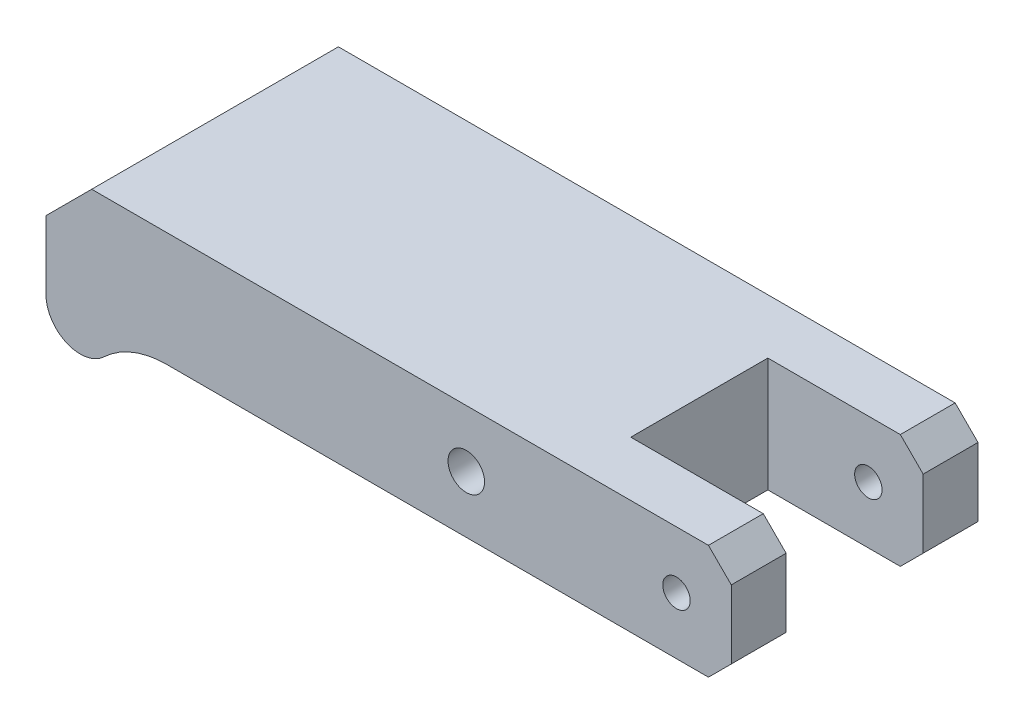
ISO-10303-21;
HEADER;
FILE_DESCRIPTION(('STEP AP214'),'2;1');
FILE_NAME('part.step','',(''),(''),'','','');
FILE_SCHEMA(('AUTOMOTIVE_DESIGN { 1 0 10303 214 1 1 1 1 }'));
ENDSEC;
DATA;
#1=APPLICATION_CONTEXT('core data for automotive mechanical design processes');
#2=APPLICATION_PROTOCOL_DEFINITION('international standard','automotive_design',2000,#1);
#3=PRODUCT_CONTEXT('',#1,'mechanical');
#4=PRODUCT('Part','Part','',(#3));
#5=PRODUCT_RELATED_PRODUCT_CATEGORY('part','',(#4));
#6=PRODUCT_DEFINITION_FORMATION('','',#4);
#7=PRODUCT_DEFINITION_CONTEXT('part definition',#1,'design');
#8=PRODUCT_DEFINITION('design','',#6,#7);
#9=PRODUCT_DEFINITION_SHAPE('','',#8);
#10=(LENGTH_UNIT() NAMED_UNIT(*) SI_UNIT(.MILLI.,.METRE.));
#11=(NAMED_UNIT(*) PLANE_ANGLE_UNIT() SI_UNIT($,.RADIAN.));
#12=(NAMED_UNIT(*) SI_UNIT($,.STERADIAN.) SOLID_ANGLE_UNIT());
#13=UNCERTAINTY_MEASURE_WITH_UNIT(LENGTH_MEASURE(1.E-05),#10,'distance_accuracy_value','');
#14=(GEOMETRIC_REPRESENTATION_CONTEXT(3) GLOBAL_UNCERTAINTY_ASSIGNED_CONTEXT((#13)) GLOBAL_UNIT_ASSIGNED_CONTEXT((#10,
#11,#12)) REPRESENTATION_CONTEXT('',''));
#15=CARTESIAN_POINT('',(0.,0.,0.));
#16=DIRECTION('',(0.,0.,1.));
#17=DIRECTION('',(1.,0.,0.));
#18=AXIS2_PLACEMENT_3D('',#15,#16,#17);
#19=CARTESIAN_POINT('',(75.,-12.5,54.));
#20=DIRECTION('',(-1.,0.,0.));
#21=DIRECTION('',(0.,0.,1.));
#22=AXIS2_PLACEMENT_3D('',#19,#20,#21);
#23=PLANE('',#22);
#24=DIRECTION('',(0.,1.,0.));
#25=VECTOR('',#24,1.);
#26=CARTESIAN_POINT('',(75.,-12.5,54.));
#27=LINE('',#26,#25);
#28=CARTESIAN_POINT('',(75.,-7.50000000000002,54.));
#29=VERTEX_POINT('',#28);
#30=CARTESIAN_POINT('',(75.,7.49999999999998,54.));
#31=VERTEX_POINT('',#30);
#32=EDGE_CURVE('E194',#29,#31,#27,.T.);
#33=ORIENTED_EDGE('',*,*,#32,.F.);
#34=DIRECTION('',(0.,0.,-1.));
#35=VECTOR('',#34,1.);
#36=CARTESIAN_POINT('',(75.,-7.50000000000002,54.));
#37=LINE('',#36,#35);
#38=CARTESIAN_POINT('',(75.,-7.50000000000002,42.));
#39=VERTEX_POINT('',#38);
#40=EDGE_CURVE('E236',#29,#39,#37,.T.);
#41=ORIENTED_EDGE('',*,*,#40,.T.);
#42=DIRECTION('',(0.,-1.,0.));
#43=VECTOR('',#42,1.);
#44=CARTESIAN_POINT('',(75.,12.5,42.));
#45=LINE('',#44,#43);
#46=CARTESIAN_POINT('',(75.,7.49999999999998,42.));
#47=VERTEX_POINT('',#46);
#48=EDGE_CURVE('E333',#47,#39,#45,.T.);
#49=ORIENTED_EDGE('',*,*,#48,.F.);
#50=DIRECTION('',(0.,0.,1.));
#51=VECTOR('',#50,1.);
#52=CARTESIAN_POINT('',(75.,7.49999999999998,54.));
#53=LINE('',#52,#51);
#54=EDGE_CURVE('E229',#47,#31,#53,.T.);
#55=ORIENTED_EDGE('',*,*,#54,.T.);
#56=EDGE_LOOP('',(#33,#41,#49,#55));
#57=FACE_BOUND('',#56,.T.);
#58=ADVANCED_FACE('F40',(#57),#23,.F.);
#59=CARTESIAN_POINT('',(63.,0.,54.));
#60=DIRECTION('',(0.,0.,-1.));
#61=DIRECTION('',(-1.,0.,0.));
#62=AXIS2_PLACEMENT_3D('',#59,#60,#61);
#63=CYLINDRICAL_SURFACE('',#62,3.00000000000001);
#64=CARTESIAN_POINT('',(63.,0.,42.));
#65=DIRECTION('',(0.,0.,1.));
#66=DIRECTION('',(1.,0.,0.));
#67=AXIS2_PLACEMENT_3D('',#64,#65,#66);
#68=CIRCLE('',#67,3.00000000000001);
#69=CARTESIAN_POINT('',(66.,0.,42.));
#70=VERTEX_POINT('',#69);
#71=EDGE_CURVE('E187',#70,#70,#68,.T.);
#72=ORIENTED_EDGE('',*,*,#71,.F.);
#73=EDGE_LOOP('',(#72));
#74=FACE_BOUND('',#73,.T.);
#75=CARTESIAN_POINT('',(63.,0.,54.));
#76=DIRECTION('',(0.,0.,1.));
#77=DIRECTION('',(1.,0.,0.));
#78=AXIS2_PLACEMENT_3D('',#75,#76,#77);
#79=CIRCLE('',#78,3.00000000000001);
#80=CARTESIAN_POINT('',(66.,0.,54.));
#81=VERTEX_POINT('',#80);
#82=EDGE_CURVE('E188',#81,#81,#79,.T.);
#83=ORIENTED_EDGE('',*,*,#82,.T.);
#84=EDGE_LOOP('',(#83));
#85=FACE_BOUND('',#84,.T.);
#86=ADVANCED_FACE('F305',(#74,#85),#63,.F.);
#87=CARTESIAN_POINT('',(-67.5,-12.5,54.));
#88=DIRECTION('',(0.,0.,1.));
#89=DIRECTION('',(1.,0.,0.));
#90=AXIS2_PLACEMENT_3D('',#87,#88,#89);
#91=PLANE('',#90);
#92=ORIENTED_EDGE('',*,*,#82,.F.);
#93=EDGE_LOOP('',(#92));
#94=FACE_BOUND('',#93,.T.);
#95=DIRECTION('',(-1.,0.,0.));
#96=VECTOR('',#95,1.);
#97=CARTESIAN_POINT('',(-75.,12.5,54.));
#98=LINE('',#97,#96);
#99=CARTESIAN_POINT('',(70.,12.5,54.));
#100=VERTEX_POINT('',#99);
#101=CARTESIAN_POINT('',(-65.,12.5,54.));
#102=VERTEX_POINT('',#101);
#103=EDGE_CURVE('E197',#100,#102,#98,.T.);
#104=ORIENTED_EDGE('',*,*,#103,.T.);
#105=DIRECTION('',(0.707106781186548,0.707106781186547,0.));
#106=VECTOR('',#105,1.);
#107=CARTESIAN_POINT('',(-78.75,-1.25,54.));
#108=LINE('',#107,#106);
#109=CARTESIAN_POINT('',(-75.,2.5,54.));
#110=VERTEX_POINT('',#109);
#111=EDGE_CURVE('E11',#102,#110,#108,.F.);
#112=ORIENTED_EDGE('',*,*,#111,.T.);
#113=DIRECTION('',(0.,-1.,0.));
#114=VECTOR('',#113,1.);
#115=CARTESIAN_POINT('',(-75.,-12.5,54.));
#116=LINE('',#115,#114);
#117=CARTESIAN_POINT('',(-75.,-12.5,54.));
#118=VERTEX_POINT('',#117);
#119=EDGE_CURVE('E200',#110,#118,#116,.T.);
#120=ORIENTED_EDGE('',*,*,#119,.T.);
#121=CARTESIAN_POINT('',(-67.5,-12.5,54.));
#122=DIRECTION('',(0.,0.,1.));
#123=DIRECTION('',(1.,0.,0.));
#124=AXIS2_PLACEMENT_3D('',#121,#122,#123);
#125=CIRCLE('',#124,7.5);
#126=CARTESIAN_POINT('',(-62.3523856123154,-17.9545454545455,54.));
#127=VERTEX_POINT('',#126);
#128=EDGE_CURVE('E202',#118,#127,#125,.T.);
#129=ORIENTED_EDGE('',*,*,#128,.T.);
#130=CARTESIAN_POINT('',(-48.6254139118231,-32.5,54.));
#131=DIRECTION('',(0.,0.,-1.));
#132=DIRECTION('',(-1.,0.,0.));
#133=AXIS2_PLACEMENT_3D('',#130,#131,#132);
#134=CIRCLE('',#133,20.);
#135=CARTESIAN_POINT('',(-48.6254139118231,-12.5,54.));
#136=VERTEX_POINT('',#135);
#137=EDGE_CURVE('E204',#127,#136,#134,.T.);
#138=ORIENTED_EDGE('',*,*,#137,.T.);
#139=DIRECTION('',(1.,0.,0.));
#140=VECTOR('',#139,1.);
#141=CARTESIAN_POINT('',(-48.6254139118231,-12.5,54.));
#142=LINE('',#141,#140);
#143=CARTESIAN_POINT('',(70.,-12.5,54.));
#144=VERTEX_POINT('',#143);
#145=EDGE_CURVE('E206',#136,#144,#142,.T.);
#146=ORIENTED_EDGE('',*,*,#145,.T.);
#147=DIRECTION('',(-0.70710678118655,-0.707106781186546,0.));
#148=VECTOR('',#147,1.);
#149=CARTESIAN_POINT('',(1.2499999999996,-81.25,54.));
#150=LINE('',#149,#148);
#151=EDGE_CURVE('E248',#144,#29,#150,.F.);
#152=ORIENTED_EDGE('',*,*,#151,.T.);
#153=ORIENTED_EDGE('',*,*,#32,.T.);
#154=DIRECTION('',(0.707106781186549,-0.707106781186547,0.));
#155=VECTOR('',#154,1.);
#156=CARTESIAN_POINT('',(13.7499999999998,68.75,54.));
#157=LINE('',#156,#155);
#158=EDGE_CURVE('E246',#31,#100,#157,.F.);
#159=ORIENTED_EDGE('',*,*,#158,.T.);
#160=EDGE_LOOP('',(#104,#112,#120,#129,#138,#146,#152,#153,#159));
#161=FACE_BOUND('',#160,.T.);
#162=CARTESIAN_POINT('',(17.,0.,54.));
#163=DIRECTION('',(0.,0.,1.));
#164=DIRECTION('',(1.,0.,0.));
#165=AXIS2_PLACEMENT_3D('',#162,#163,#164);
#166=CIRCLE('',#165,4.);
#167=CARTESIAN_POINT('',(21.,0.,54.));
#168=VERTEX_POINT('',#167);
#169=EDGE_CURVE('E180',#168,#168,#166,.T.);
#170=ORIENTED_EDGE('',*,*,#169,.F.);
#171=EDGE_LOOP('',(#170));
#172=FACE_BOUND('',#171,.T.);
#173=ADVANCED_FACE('F294',(#94,#161,#172),#91,.T.);
#174=CARTESIAN_POINT('',(-67.5,-12.5,0.));
#175=DIRECTION('',(0.,0.,1.));
#176=DIRECTION('',(1.,0.,0.));
#177=AXIS2_PLACEMENT_3D('',#174,#175,#176);
#178=PLANE('',#177);
#179=DIRECTION('',(0.,-1.,0.));
#180=VECTOR('',#179,1.);
#181=CARTESIAN_POINT('',(-75.,-12.5,0.));
#182=LINE('',#181,#180);
#183=CARTESIAN_POINT('',(-75.,2.5,0.));
#184=VERTEX_POINT('',#183);
#185=CARTESIAN_POINT('',(-75.,-12.5,0.));
#186=VERTEX_POINT('',#185);
#187=EDGE_CURVE('E214',#184,#186,#182,.T.);
#188=ORIENTED_EDGE('',*,*,#187,.F.);
#189=DIRECTION('',(-0.707106781186548,-0.707106781186547,0.));
#190=VECTOR('',#189,1.);
#191=CARTESIAN_POINT('',(-75.,2.5,0.));
#192=LINE('',#191,#190);
#193=CARTESIAN_POINT('',(-65.,12.5,0.));
#194=VERTEX_POINT('',#193);
#195=EDGE_CURVE('E63',#184,#194,#192,.F.);
#196=ORIENTED_EDGE('',*,*,#195,.T.);
#197=DIRECTION('',(-1.,0.,0.));
#198=VECTOR('',#197,1.);
#199=CARTESIAN_POINT('',(-75.,12.5,0.));
#200=LINE('',#199,#198);
#201=CARTESIAN_POINT('',(70.,12.5,0.));
#202=VERTEX_POINT('',#201);
#203=EDGE_CURVE('E212',#202,#194,#200,.T.);
#204=ORIENTED_EDGE('',*,*,#203,.F.);
#205=DIRECTION('',(-0.707106781186549,0.707106781186547,0.));
#206=VECTOR('',#205,1.);
#207=CARTESIAN_POINT('',(70.,12.5,0.));
#208=LINE('',#207,#206);
#209=CARTESIAN_POINT('',(75.,7.49999999999998,0.));
#210=VERTEX_POINT('',#209);
#211=EDGE_CURVE('E255',#202,#210,#208,.F.);
#212=ORIENTED_EDGE('',*,*,#211,.T.);
#213=DIRECTION('',(0.,1.,0.));
#214=VECTOR('',#213,1.);
#215=CARTESIAN_POINT('',(75.,-12.5,0.));
#216=LINE('',#215,#214);
#217=CARTESIAN_POINT('',(75.,-7.50000000000002,0.));
#218=VERTEX_POINT('',#217);
#219=EDGE_CURVE('E191',#218,#210,#216,.T.);
#220=ORIENTED_EDGE('',*,*,#219,.F.);
#221=DIRECTION('',(0.70710678118655,0.707106781186546,0.));
#222=VECTOR('',#221,1.);
#223=CARTESIAN_POINT('',(75.,-7.50000000000002,0.));
#224=LINE('',#223,#222);
#225=CARTESIAN_POINT('',(70.,-12.5,0.));
#226=VERTEX_POINT('',#225);
#227=EDGE_CURVE('E257',#218,#226,#224,.F.);
#228=ORIENTED_EDGE('',*,*,#227,.T.);
#229=DIRECTION('',(1.,0.,0.));
#230=VECTOR('',#229,1.);
#231=CARTESIAN_POINT('',(-48.6254139118231,-12.5,0.));
#232=LINE('',#231,#230);
#233=CARTESIAN_POINT('',(-48.6254139118231,-12.5,0.));
#234=VERTEX_POINT('',#233);
#235=EDGE_CURVE('E198',#234,#226,#232,.T.);
#236=ORIENTED_EDGE('',*,*,#235,.F.);
#237=CARTESIAN_POINT('',(-48.6254139118231,-32.5,0.));
#238=DIRECTION('',(0.,0.,-1.));
#239=DIRECTION('',(-1.,0.,0.));
#240=AXIS2_PLACEMENT_3D('',#237,#238,#239);
#241=CIRCLE('',#240,20.);
#242=CARTESIAN_POINT('',(-62.3523856123154,-17.9545454545455,0.));
#243=VERTEX_POINT('',#242);
#244=EDGE_CURVE('E218',#243,#234,#241,.T.);
#245=ORIENTED_EDGE('',*,*,#244,.F.);
#246=CARTESIAN_POINT('',(-67.5,-12.5,0.));
#247=DIRECTION('',(0.,0.,1.));
#248=DIRECTION('',(1.,0.,0.));
#249=AXIS2_PLACEMENT_3D('',#246,#247,#248);
#250=CIRCLE('',#249,7.5);
#251=EDGE_CURVE('E216',#186,#243,#250,.T.);
#252=ORIENTED_EDGE('',*,*,#251,.F.);
#253=EDGE_LOOP('',(#188,#196,#204,#212,#220,#228,#236,#245,#252));
#254=FACE_BOUND('',#253,.T.);
#255=CARTESIAN_POINT('',(63.,0.,0.));
#256=DIRECTION('',(0.,0.,1.));
#257=DIRECTION('',(1.,0.,0.));
#258=AXIS2_PLACEMENT_3D('',#255,#256,#257);
#259=CIRCLE('',#258,3.00000000000001);
#260=CARTESIAN_POINT('',(66.,0.,0.));
#261=VERTEX_POINT('',#260);
#262=EDGE_CURVE('E183',#261,#261,#259,.T.);
#263=ORIENTED_EDGE('',*,*,#262,.T.);
#264=EDGE_LOOP('',(#263));
#265=FACE_BOUND('',#264,.T.);
#266=CARTESIAN_POINT('',(17.,0.,0.));
#267=DIRECTION('',(0.,0.,1.));
#268=DIRECTION('',(1.,0.,0.));
#269=AXIS2_PLACEMENT_3D('',#266,#267,#268);
#270=CIRCLE('',#269,4.);
#271=CARTESIAN_POINT('',(21.,0.,0.));
#272=VERTEX_POINT('',#271);
#273=EDGE_CURVE('E184',#272,#272,#270,.T.);
#274=ORIENTED_EDGE('',*,*,#273,.T.);
#275=EDGE_LOOP('',(#274));
#276=FACE_BOUND('',#275,.T.);
#277=ADVANCED_FACE('F280',(#254,#265,#276),#178,.F.);
#278=DIRECTION('',(0.,1.,0.));
#279=VECTOR('',#278,1.);
#280=CARTESIAN_POINT('',(75.,12.5,12.));
#281=LINE('',#280,#279);
#282=CARTESIAN_POINT('',(75.,-7.50000000000002,12.));
#283=VERTEX_POINT('',#282);
#284=CARTESIAN_POINT('',(75.,7.49999999999998,12.));
#285=VERTEX_POINT('',#284);
#286=EDGE_CURVE('E328',#283,#285,#281,.T.);
#287=ORIENTED_EDGE('',*,*,#286,.F.);
#288=DIRECTION('',(0.,0.,-1.));
#289=VECTOR('',#288,1.);
#290=CARTESIAN_POINT('',(75.,-7.50000000000002,54.));
#291=LINE('',#290,#289);
#292=EDGE_CURVE('E252',#283,#218,#291,.T.);
#293=ORIENTED_EDGE('',*,*,#292,.T.);
#294=ORIENTED_EDGE('',*,*,#219,.T.);
#295=DIRECTION('',(0.,0.,1.));
#296=VECTOR('',#295,1.);
#297=CARTESIAN_POINT('',(75.,7.49999999999998,54.));
#298=LINE('',#297,#296);
#299=EDGE_CURVE('E250',#210,#285,#298,.T.);
#300=ORIENTED_EDGE('',*,*,#299,.T.);
#301=EDGE_LOOP('',(#287,#293,#294,#300));
#302=FACE_BOUND('',#301,.T.);
#303=ADVANCED_FACE('F308',(#302),#23,.F.);
#304=CARTESIAN_POINT('',(-75.,12.5,54.));
#305=DIRECTION('',(0.,-1.,0.));
#306=DIRECTION('',(0.,0.,-1.));
#307=AXIS2_PLACEMENT_3D('',#304,#305,#306);
#308=PLANE('',#307);
#309=ORIENTED_EDGE('',*,*,#203,.T.);
#310=DIRECTION('',(0.,0.,1.));
#311=VECTOR('',#310,1.);
#312=CARTESIAN_POINT('',(-65.,12.5,54.));
#313=LINE('',#312,#311);
#314=EDGE_CURVE('E49',#194,#102,#313,.T.);
#315=ORIENTED_EDGE('',*,*,#314,.T.);
#316=ORIENTED_EDGE('',*,*,#103,.F.);
#317=DIRECTION('',(0.,0.,-1.));
#318=VECTOR('',#317,1.);
#319=CARTESIAN_POINT('',(70.,12.5,54.));
#320=LINE('',#319,#318);
#321=CARTESIAN_POINT('',(70.,12.5,42.));
#322=VERTEX_POINT('',#321);
#323=EDGE_CURVE('E263',#100,#322,#320,.T.);
#324=ORIENTED_EDGE('',*,*,#323,.T.);
#325=DIRECTION('',(1.,0.,0.));
#326=VECTOR('',#325,1.);
#327=CARTESIAN_POINT('',(41.,12.5,42.));
#328=LINE('',#327,#326);
#329=CARTESIAN_POINT('',(41.,12.5,42.));
#330=VERTEX_POINT('',#329);
#331=EDGE_CURVE('E175',#330,#322,#328,.T.);
#332=ORIENTED_EDGE('',*,*,#331,.F.);
#333=DIRECTION('',(0.,0.,1.));
#334=VECTOR('',#333,1.);
#335=CARTESIAN_POINT('',(41.,12.5,42.));
#336=LINE('',#335,#334);
#337=CARTESIAN_POINT('',(41.,12.5,12.));
#338=VERTEX_POINT('',#337);
#339=EDGE_CURVE('E159',#338,#330,#336,.T.);
#340=ORIENTED_EDGE('',*,*,#339,.F.);
#341=DIRECTION('',(1.,0.,0.));
#342=VECTOR('',#341,1.);
#343=CARTESIAN_POINT('',(41.,12.5,12.));
#344=LINE('',#343,#342);
#345=CARTESIAN_POINT('',(70.,12.5,12.));
#346=VERTEX_POINT('',#345);
#347=EDGE_CURVE('E155',#338,#346,#344,.T.);
#348=ORIENTED_EDGE('',*,*,#347,.T.);
#349=DIRECTION('',(0.,0.,-1.));
#350=VECTOR('',#349,1.);
#351=CARTESIAN_POINT('',(70.,12.5,54.));
#352=LINE('',#351,#350);
#353=EDGE_CURVE('E266',#346,#202,#352,.T.);
#354=ORIENTED_EDGE('',*,*,#353,.T.);
#355=EDGE_LOOP('',(#309,#315,#316,#324,#332,#340,#348,#354));
#356=FACE_BOUND('',#355,.T.);
#357=ADVANCED_FACE('F319',(#356),#308,.F.);
#358=CARTESIAN_POINT('',(-75.,-12.5,54.));
#359=DIRECTION('',(1.,0.,0.));
#360=DIRECTION('',(0.,0.,-1.));
#361=AXIS2_PLACEMENT_3D('',#358,#359,#360);
#362=PLANE('',#361);
#363=ORIENTED_EDGE('',*,*,#119,.F.);
#364=DIRECTION('',(0.,0.,-1.));
#365=VECTOR('',#364,1.);
#366=CARTESIAN_POINT('',(-75.,2.5,54.));
#367=LINE('',#366,#365);
#368=EDGE_CURVE('E269',#110,#184,#367,.T.);
#369=ORIENTED_EDGE('',*,*,#368,.T.);
#370=ORIENTED_EDGE('',*,*,#187,.T.);
#371=DIRECTION('',(0.,0.,-1.));
#372=VECTOR('',#371,1.);
#373=CARTESIAN_POINT('',(-75.,-12.5,54.));
#374=LINE('',#373,#372);
#375=EDGE_CURVE('E226',#118,#186,#374,.T.);
#376=ORIENTED_EDGE('',*,*,#375,.F.);
#377=EDGE_LOOP('',(#363,#369,#370,#376));
#378=FACE_BOUND('',#377,.T.);
#379=ADVANCED_FACE('F275',(#378),#362,.F.);
#380=CARTESIAN_POINT('',(-67.5,-12.5,54.));
#381=DIRECTION('',(0.,0.,-1.));
#382=DIRECTION('',(-1.,0.,0.));
#383=AXIS2_PLACEMENT_3D('',#380,#381,#382);
#384=CYLINDRICAL_SURFACE('',#383,7.5);
#385=ORIENTED_EDGE('',*,*,#251,.T.);
#386=DIRECTION('',(0.,0.,-1.));
#387=VECTOR('',#386,1.);
#388=CARTESIAN_POINT('',(-62.3523856123154,-17.9545454545455,54.));
#389=LINE('',#388,#387);
#390=EDGE_CURVE('E223',#127,#243,#389,.T.);
#391=ORIENTED_EDGE('',*,*,#390,.F.);
#392=ORIENTED_EDGE('',*,*,#128,.F.);
#393=ORIENTED_EDGE('',*,*,#375,.T.);
#394=EDGE_LOOP('',(#385,#391,#392,#393));
#395=FACE_BOUND('',#394,.T.);
#396=ADVANCED_FACE('F286',(#395),#384,.T.);
#397=CARTESIAN_POINT('',(-48.6254139118231,-32.5,54.));
#398=DIRECTION('',(0.,0.,-1.));
#399=DIRECTION('',(-1.,0.,0.));
#400=AXIS2_PLACEMENT_3D('',#397,#398,#399);
#401=CYLINDRICAL_SURFACE('',#400,20.);
#402=ORIENTED_EDGE('',*,*,#244,.T.);
#403=DIRECTION('',(0.,0.,-1.));
#404=VECTOR('',#403,1.);
#405=CARTESIAN_POINT('',(-48.6254139118231,-12.5,54.));
#406=LINE('',#405,#404);
#407=EDGE_CURVE('E209',#136,#234,#406,.T.);
#408=ORIENTED_EDGE('',*,*,#407,.F.);
#409=ORIENTED_EDGE('',*,*,#137,.F.);
#410=ORIENTED_EDGE('',*,*,#390,.T.);
#411=EDGE_LOOP('',(#402,#408,#409,#410));
#412=FACE_BOUND('',#411,.T.);
#413=ADVANCED_FACE('F290',(#412),#401,.F.);
#414=CARTESIAN_POINT('',(-48.6254139118231,-12.5,54.));
#415=DIRECTION('',(0.,1.,0.));
#416=DIRECTION('',(0.,0.,1.));
#417=AXIS2_PLACEMENT_3D('',#414,#415,#416);
#418=PLANE('',#417);
#419=DIRECTION('',(1.,0.,0.));
#420=VECTOR('',#419,1.);
#421=CARTESIAN_POINT('',(41.,-12.5,42.));
#422=LINE('',#421,#420);
#423=CARTESIAN_POINT('',(41.,-12.5,42.));
#424=VERTEX_POINT('',#423);
#425=CARTESIAN_POINT('',(70.,-12.5,42.));
#426=VERTEX_POINT('',#425);
#427=EDGE_CURVE('E173',#424,#426,#422,.T.);
#428=ORIENTED_EDGE('',*,*,#427,.T.);
#429=DIRECTION('',(0.,0.,1.));
#430=VECTOR('',#429,1.);
#431=CARTESIAN_POINT('',(70.,-12.5,54.));
#432=LINE('',#431,#430);
#433=EDGE_CURVE('E244',#426,#144,#432,.T.);
#434=ORIENTED_EDGE('',*,*,#433,.T.);
#435=ORIENTED_EDGE('',*,*,#145,.F.);
#436=ORIENTED_EDGE('',*,*,#407,.T.);
#437=ORIENTED_EDGE('',*,*,#235,.T.);
#438=DIRECTION('',(0.,0.,1.));
#439=VECTOR('',#438,1.);
#440=CARTESIAN_POINT('',(70.,-12.5,54.));
#441=LINE('',#440,#439);
#442=CARTESIAN_POINT('',(70.,-12.5,12.));
#443=VERTEX_POINT('',#442);
#444=EDGE_CURVE('E172',#226,#443,#441,.T.);
#445=ORIENTED_EDGE('',*,*,#444,.T.);
#446=DIRECTION('',(1.,0.,0.));
#447=VECTOR('',#446,1.);
#448=CARTESIAN_POINT('',(41.,-12.5,12.));
#449=LINE('',#448,#447);
#450=CARTESIAN_POINT('',(41.,-12.5,12.));
#451=VERTEX_POINT('',#450);
#452=EDGE_CURVE('E152',#451,#443,#449,.T.);
#453=ORIENTED_EDGE('',*,*,#452,.F.);
#454=DIRECTION('',(0.,0.,-1.));
#455=VECTOR('',#454,1.);
#456=CARTESIAN_POINT('',(41.,-12.5,42.));
#457=LINE('',#456,#455);
#458=EDGE_CURVE('E160',#424,#451,#457,.T.);
#459=ORIENTED_EDGE('',*,*,#458,.F.);
#460=EDGE_LOOP('',(#428,#434,#435,#436,#437,#445,#453,#459));
#461=FACE_BOUND('',#460,.T.);
#462=ADVANCED_FACE('F169',(#461),#418,.F.);
#463=CARTESIAN_POINT('',(63.,0.,12.));
#464=DIRECTION('',(0.,0.,-1.));
#465=DIRECTION('',(0.,1.,0.));
#466=AXIS2_PLACEMENT_3D('',#463,#464,#465);
#467=CIRCLE('',#466,3.00000000000001);
#468=CARTESIAN_POINT('',(63.,3.00000000000001,12.));
#469=VERTEX_POINT('',#468);
#470=EDGE_CURVE('E230',#469,#469,#467,.T.);
#471=ORIENTED_EDGE('',*,*,#470,.F.);
#472=EDGE_LOOP('',(#471));
#473=FACE_BOUND('',#472,.T.);
#474=ORIENTED_EDGE('',*,*,#262,.F.);
#475=EDGE_LOOP('',(#474));
#476=FACE_BOUND('',#475,.T.);
#477=ADVANCED_FACE('F314',(#473,#476),#63,.F.);
#478=CARTESIAN_POINT('',(17.,0.,54.));
#479=DIRECTION('',(0.,0.,-1.));
#480=DIRECTION('',(-1.,0.,0.));
#481=AXIS2_PLACEMENT_3D('',#478,#479,#480);
#482=CYLINDRICAL_SURFACE('',#481,4.);
#483=ORIENTED_EDGE('',*,*,#169,.T.);
#484=EDGE_LOOP('',(#483));
#485=FACE_BOUND('',#484,.T.);
#486=ORIENTED_EDGE('',*,*,#273,.F.);
#487=EDGE_LOOP('',(#486));
#488=FACE_BOUND('',#487,.T.);
#489=ADVANCED_FACE('F388',(#485,#488),#482,.F.);
#490=CARTESIAN_POINT('',(41.,12.5,42.));
#491=DIRECTION('',(0.,0.,1.));
#492=DIRECTION('',(1.,0.,0.));
#493=AXIS2_PLACEMENT_3D('',#490,#491,#492);
#494=PLANE('',#493);
#495=ORIENTED_EDGE('',*,*,#71,.T.);
#496=EDGE_LOOP('',(#495));
#497=FACE_BOUND('',#496,.T.);
#498=ORIENTED_EDGE('',*,*,#48,.T.);
#499=DIRECTION('',(0.70710678118655,0.707106781186546,0.));
#500=VECTOR('',#499,1.);
#501=CARTESIAN_POINT('',(75.,-7.50000000000002,42.));
#502=LINE('',#501,#500);
#503=EDGE_CURVE('E241',#39,#426,#502,.F.);
#504=ORIENTED_EDGE('',*,*,#503,.T.);
#505=ORIENTED_EDGE('',*,*,#427,.F.);
#506=DIRECTION('',(0.,-1.,0.));
#507=VECTOR('',#506,1.);
#508=CARTESIAN_POINT('',(41.,12.5,42.));
#509=LINE('',#508,#507);
#510=EDGE_CURVE('E164',#330,#424,#509,.T.);
#511=ORIENTED_EDGE('',*,*,#510,.F.);
#512=ORIENTED_EDGE('',*,*,#331,.T.);
#513=DIRECTION('',(-0.707106781186549,0.707106781186547,0.));
#514=VECTOR('',#513,1.);
#515=CARTESIAN_POINT('',(70.,12.5,42.));
#516=LINE('',#515,#514);
#517=EDGE_CURVE('E239',#322,#47,#516,.F.);
#518=ORIENTED_EDGE('',*,*,#517,.T.);
#519=EDGE_LOOP('',(#498,#504,#505,#511,#512,#518));
#520=FACE_BOUND('',#519,.T.);
#521=ADVANCED_FACE('F349',(#497,#520),#494,.F.);
#522=CARTESIAN_POINT('',(41.,12.5,12.));
#523=DIRECTION('',(0.,0.,-1.));
#524=DIRECTION('',(0.,1.,0.));
#525=AXIS2_PLACEMENT_3D('',#522,#523,#524);
#526=PLANE('',#525);
#527=ORIENTED_EDGE('',*,*,#470,.T.);
#528=EDGE_LOOP('',(#527));
#529=FACE_BOUND('',#528,.T.);
#530=ORIENTED_EDGE('',*,*,#452,.T.);
#531=DIRECTION('',(-0.70710678118655,-0.707106781186546,0.));
#532=VECTOR('',#531,1.);
#533=CARTESIAN_POINT('',(75.,-7.50000000000001,12.));
#534=LINE('',#533,#532);
#535=EDGE_CURVE('E261',#443,#283,#534,.F.);
#536=ORIENTED_EDGE('',*,*,#535,.T.);
#537=ORIENTED_EDGE('',*,*,#286,.T.);
#538=DIRECTION('',(0.707106781186549,-0.707106781186547,0.));
#539=VECTOR('',#538,1.);
#540=CARTESIAN_POINT('',(70.,12.5,12.));
#541=LINE('',#540,#539);
#542=EDGE_CURVE('E259',#285,#346,#541,.F.);
#543=ORIENTED_EDGE('',*,*,#542,.T.);
#544=ORIENTED_EDGE('',*,*,#347,.F.);
#545=DIRECTION('',(0.,1.,0.));
#546=VECTOR('',#545,1.);
#547=CARTESIAN_POINT('',(41.,12.5,12.));
#548=LINE('',#547,#546);
#549=EDGE_CURVE('E148',#451,#338,#548,.T.);
#550=ORIENTED_EDGE('',*,*,#549,.F.);
#551=EDGE_LOOP('',(#530,#536,#537,#543,#544,#550));
#552=FACE_BOUND('',#551,.T.);
#553=ADVANCED_FACE('F150',(#529,#552),#526,.F.);
#554=CARTESIAN_POINT('',(41.,0.,0.));
#555=DIRECTION('',(1.,0.,0.));
#556=DIRECTION('',(0.,0.,-1.));
#557=AXIS2_PLACEMENT_3D('',#554,#555,#556);
#558=PLANE('',#557);
#559=ORIENTED_EDGE('',*,*,#510,.T.);
#560=ORIENTED_EDGE('',*,*,#458,.T.);
#561=ORIENTED_EDGE('',*,*,#549,.T.);
#562=ORIENTED_EDGE('',*,*,#339,.T.);
#563=EDGE_LOOP('',(#559,#560,#561,#562));
#564=FACE_BOUND('',#563,.T.);
#565=ADVANCED_FACE('F163',(#564),#558,.T.);
#566=CARTESIAN_POINT('',(75.,-7.50000000000002,54.));
#567=DIRECTION('',(-0.707106781186545,0.707106781186549,0.));
#568=DIRECTION('',(0.,0.,-1.));
#569=AXIS2_PLACEMENT_3D('',#566,#567,#568);
#570=PLANE('',#569);
#571=ORIENTED_EDGE('',*,*,#151,.F.);
#572=ORIENTED_EDGE('',*,*,#433,.F.);
#573=ORIENTED_EDGE('',*,*,#503,.F.);
#574=ORIENTED_EDGE('',*,*,#40,.F.);
#575=EDGE_LOOP('',(#571,#572,#573,#574));
#576=FACE_BOUND('',#575,.T.);
#577=ADVANCED_FACE('F339',(#576),#570,.F.);
#578=CARTESIAN_POINT('',(75.,-7.50000000000002,54.));
#579=DIRECTION('',(-0.707106781186545,0.707106781186549,0.));
#580=DIRECTION('',(0.,0.,-1.));
#581=AXIS2_PLACEMENT_3D('',#578,#579,#580);
#582=PLANE('',#581);
#583=ORIENTED_EDGE('',*,*,#535,.F.);
#584=ORIENTED_EDGE('',*,*,#444,.F.);
#585=ORIENTED_EDGE('',*,*,#227,.F.);
#586=ORIENTED_EDGE('',*,*,#292,.F.);
#587=EDGE_LOOP('',(#583,#584,#585,#586));
#588=FACE_BOUND('',#587,.T.);
#589=ADVANCED_FACE('F336',(#588),#582,.F.);
#590=CARTESIAN_POINT('',(70.,12.5,54.));
#591=DIRECTION('',(-0.707106781186546,-0.707106781186548,0.));
#592=DIRECTION('',(0.,0.,-1.));
#593=AXIS2_PLACEMENT_3D('',#590,#591,#592);
#594=PLANE('',#593);
#595=ORIENTED_EDGE('',*,*,#542,.F.);
#596=ORIENTED_EDGE('',*,*,#299,.F.);
#597=ORIENTED_EDGE('',*,*,#211,.F.);
#598=ORIENTED_EDGE('',*,*,#353,.F.);
#599=EDGE_LOOP('',(#595,#596,#597,#598));
#600=FACE_BOUND('',#599,.T.);
#601=ADVANCED_FACE('F302',(#600),#594,.F.);
#602=CARTESIAN_POINT('',(70.,12.5,54.));
#603=DIRECTION('',(-0.707106781186546,-0.707106781186548,0.));
#604=DIRECTION('',(0.,0.,-1.));
#605=AXIS2_PLACEMENT_3D('',#602,#603,#604);
#606=PLANE('',#605);
#607=ORIENTED_EDGE('',*,*,#158,.F.);
#608=ORIENTED_EDGE('',*,*,#54,.F.);
#609=ORIENTED_EDGE('',*,*,#517,.F.);
#610=ORIENTED_EDGE('',*,*,#323,.F.);
#611=EDGE_LOOP('',(#607,#608,#609,#610));
#612=FACE_BOUND('',#611,.T.);
#613=ADVANCED_FACE('F298',(#612),#606,.F.);
#614=CARTESIAN_POINT('',(-75.,2.5,54.));
#615=DIRECTION('',(0.707106781186547,-0.707106781186548,0.));
#616=DIRECTION('',(0.,0.,-1.));
#617=AXIS2_PLACEMENT_3D('',#614,#615,#616);
#618=PLANE('',#617);
#619=ORIENTED_EDGE('',*,*,#111,.F.);
#620=ORIENTED_EDGE('',*,*,#314,.F.);
#621=ORIENTED_EDGE('',*,*,#195,.F.);
#622=ORIENTED_EDGE('',*,*,#368,.F.);
#623=EDGE_LOOP('',(#619,#620,#621,#622));
#624=FACE_BOUND('',#623,.T.);
#625=ADVANCED_FACE('F43',(#624),#618,.F.);
#626=CLOSED_SHELL('',(#58,#86,#173,#277,#303,#357,#379,#396,#413,#462,#477,#489,#521,#553,#565,
#577,#589,#601,#613,#625));
#627=MANIFOLD_SOLID_BREP('B2',#626);
#628=ADVANCED_BREP_SHAPE_REPRESENTATION('',(#18,#627),#14);
#629=SHAPE_DEFINITION_REPRESENTATION(#9,#628);
ENDSEC;
END-ISO-10303-21;
